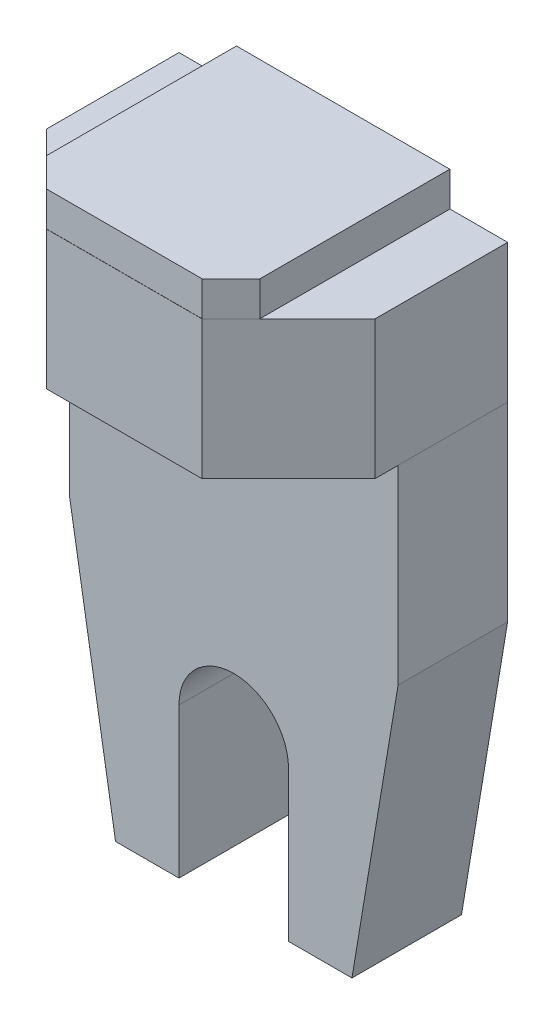
ISO-10303-21;
HEADER;
FILE_DESCRIPTION(('STEP AP214'),'2;1');
FILE_NAME('part.step','',(''),(''),'','','');
FILE_SCHEMA(('AUTOMOTIVE_DESIGN { 1 0 10303 214 1 1 1 1 }'));
ENDSEC;
DATA;
#1=APPLICATION_CONTEXT('core data for automotive mechanical design processes');
#2=APPLICATION_PROTOCOL_DEFINITION('international standard','automotive_design',2000,#1);
#3=PRODUCT_CONTEXT('',#1,'mechanical');
#4=PRODUCT('Part','Part','',(#3));
#5=PRODUCT_RELATED_PRODUCT_CATEGORY('part','',(#4));
#6=PRODUCT_DEFINITION_FORMATION('','',#4);
#7=PRODUCT_DEFINITION_CONTEXT('part definition',#1,'design');
#8=PRODUCT_DEFINITION('design','',#6,#7);
#9=PRODUCT_DEFINITION_SHAPE('','',#8);
#10=(LENGTH_UNIT() NAMED_UNIT(*) SI_UNIT(.MILLI.,.METRE.));
#11=(NAMED_UNIT(*) PLANE_ANGLE_UNIT() SI_UNIT($,.RADIAN.));
#12=(NAMED_UNIT(*) SI_UNIT($,.STERADIAN.) SOLID_ANGLE_UNIT());
#13=UNCERTAINTY_MEASURE_WITH_UNIT(LENGTH_MEASURE(1.E-05),#10,'distance_accuracy_value','');
#14=(GEOMETRIC_REPRESENTATION_CONTEXT(3) GLOBAL_UNCERTAINTY_ASSIGNED_CONTEXT((#13)) GLOBAL_UNIT_ASSIGNED_CONTEXT((#10,
#11,#12)) REPRESENTATION_CONTEXT('',''));
#15=CARTESIAN_POINT('',(0.,0.,0.));
#16=DIRECTION('',(0.,0.,1.));
#17=DIRECTION('',(1.,0.,0.));
#18=AXIS2_PLACEMENT_3D('',#15,#16,#17);
#19=CARTESIAN_POINT('',(-28.5,52.5,19.));
#20=DIRECTION('',(0.,-1.,0.));
#21=DIRECTION('',(0.,0.,-1.));
#22=AXIS2_PLACEMENT_3D('',#19,#20,#21);
#23=PLANE('',#22);
#24=DIRECTION('',(0.,0.,-1.));
#25=VECTOR('',#24,1.);
#26=CARTESIAN_POINT('',(28.5016703983001,52.5,0.));
#27=LINE('',#26,#25);
#28=CARTESIAN_POINT('',(28.5016703983001,52.5,23.));
#29=VERTEX_POINT('',#28);
#30=CARTESIAN_POINT('',(28.5016703983001,52.5,0.));
#31=VERTEX_POINT('',#30);
#32=EDGE_CURVE('E221',#29,#31,#27,.T.);
#33=ORIENTED_EDGE('',*,*,#32,.T.);
#34=DIRECTION('',(-1.,0.,0.));
#35=VECTOR('',#34,1.);
#36=CARTESIAN_POINT('',(-28.5,52.5,0.));
#37=LINE('',#36,#35);
#38=CARTESIAN_POINT('',(-28.5,52.5,0.));
#39=VERTEX_POINT('',#38);
#40=EDGE_CURVE('E357',#31,#39,#37,.T.);
#41=ORIENTED_EDGE('',*,*,#40,.T.);
#42=DIRECTION('',(0.,0.,-1.));
#43=VECTOR('',#42,1.);
#44=CARTESIAN_POINT('',(-28.5,52.5,19.));
#45=LINE('',#44,#43);
#46=CARTESIAN_POINT('',(-28.5,52.5,23.));
#47=VERTEX_POINT('',#46);
#48=EDGE_CURVE('E11',#47,#39,#45,.T.);
#49=ORIENTED_EDGE('',*,*,#48,.F.);
#50=DIRECTION('',(0.707106781186548,0.,0.707106781186547));
#51=VECTOR('',#50,1.);
#52=CARTESIAN_POINT('',(-28.5,52.5,23.));
#53=LINE('',#52,#51);
#54=CARTESIAN_POINT('',(-13.5,52.5,38.));
#55=VERTEX_POINT('',#54);
#56=EDGE_CURVE('E206',#47,#55,#53,.T.);
#57=ORIENTED_EDGE('',*,*,#56,.T.);
#58=DIRECTION('',(1.,0.,0.));
#59=VECTOR('',#58,1.);
#60=CARTESIAN_POINT('',(-13.5,52.5,38.));
#61=LINE('',#60,#59);
#62=CARTESIAN_POINT('',(13.5016703983001,52.5,38.));
#63=VERTEX_POINT('',#62);
#64=EDGE_CURVE('E211',#55,#63,#61,.T.);
#65=ORIENTED_EDGE('',*,*,#64,.T.);
#66=DIRECTION('',(0.707106781186547,0.,-0.707106781186548));
#67=VECTOR('',#66,1.);
#68=CARTESIAN_POINT('',(13.5016703983001,52.5,38.));
#69=LINE('',#68,#67);
#70=EDGE_CURVE('E245',#63,#29,#69,.T.);
#71=ORIENTED_EDGE('',*,*,#70,.T.);
#72=EDGE_LOOP('',(#33,#41,#49,#57,#65,#71));
#73=FACE_BOUND('',#72,.T.);
#74=DIRECTION('',(0.,0.,-1.));
#75=VECTOR('',#74,1.);
#76=CARTESIAN_POINT('',(18.5,52.5,0.0299013030524108));
#77=LINE('',#76,#75);
#78=CARTESIAN_POINT('',(18.5,52.5,32.9731751320924));
#79=VERTEX_POINT('',#78);
#80=CARTESIAN_POINT('',(18.5,52.5,0.0299013030524108));
#81=VERTEX_POINT('',#80);
#82=EDGE_CURVE('E55',#79,#81,#77,.T.);
#83=ORIENTED_EDGE('',*,*,#82,.F.);
#84=DIRECTION('',(0.707106781186547,0.,-0.707106781186549));
#85=VECTOR('',#84,1.);
#86=CARTESIAN_POINT('',(18.5,52.5,32.9731751320924));
#87=LINE('',#86,#85);
#88=CARTESIAN_POINT('',(13.5,52.5,37.9731751320924));
#89=VERTEX_POINT('',#88);
#90=EDGE_CURVE('E59',#89,#79,#87,.T.);
#91=ORIENTED_EDGE('',*,*,#90,.F.);
#92=DIRECTION('',(1.,0.,0.));
#93=VECTOR('',#92,1.);
#94=CARTESIAN_POINT('',(13.5,52.5,37.9731751320924));
#95=LINE('',#94,#93);
#96=CARTESIAN_POINT('',(-13.5,52.5,37.9731751320924));
#97=VERTEX_POINT('',#96);
#98=EDGE_CURVE('E634',#97,#89,#95,.T.);
#99=ORIENTED_EDGE('',*,*,#98,.F.);
#100=DIRECTION('',(0.707106781186547,0.,0.707106781186548));
#101=VECTOR('',#100,1.);
#102=CARTESIAN_POINT('',(-13.5,52.5,37.9731751320924));
#103=LINE('',#102,#101);
#104=CARTESIAN_POINT('',(-18.5,52.5,32.9731751320924));
#105=VERTEX_POINT('',#104);
#106=EDGE_CURVE('E654',#105,#97,#103,.T.);
#107=ORIENTED_EDGE('',*,*,#106,.F.);
#108=DIRECTION('',(0.,0.,1.));
#109=VECTOR('',#108,1.);
#110=CARTESIAN_POINT('',(-18.5,52.5,0.0299013030524153));
#111=LINE('',#110,#109);
#112=CARTESIAN_POINT('',(-18.5,52.5,0.0299013030524153));
#113=VERTEX_POINT('',#112);
#114=EDGE_CURVE('E657',#113,#105,#111,.T.);
#115=ORIENTED_EDGE('',*,*,#114,.F.);
#116=DIRECTION('',(-1.,0.,0.));
#117=VECTOR('',#116,1.);
#118=CARTESIAN_POINT('',(18.5,52.5,0.0299013030524108));
#119=LINE('',#118,#117);
#120=EDGE_CURVE('E659',#81,#113,#119,.T.);
#121=ORIENTED_EDGE('',*,*,#120,.F.);
#122=EDGE_LOOP('',(#83,#91,#99,#107,#115,#121));
#123=FACE_BOUND('',#122,.T.);
#124=ADVANCED_FACE('F39',(#73,#123),#23,.F.);
#125=CARTESIAN_POINT('',(28.5,-52.5,19.));
#126=DIRECTION('',(-1.,0.,0.));
#127=DIRECTION('',(0.,0.,1.));
#128=AXIS2_PLACEMENT_3D('',#125,#126,#127);
#129=PLANE('',#128);
#130=DIRECTION('',(0.,0.,-1.));
#131=VECTOR('',#130,1.);
#132=CARTESIAN_POINT('',(28.5,28.5,19.));
#133=LINE('',#132,#131);
#134=CARTESIAN_POINT('',(28.5,28.5,19.));
#135=VERTEX_POINT('',#134);
#136=CARTESIAN_POINT('',(28.5,28.5,0.));
#137=VERTEX_POINT('',#136);
#138=EDGE_CURVE('E272',#135,#137,#133,.T.);
#139=ORIENTED_EDGE('',*,*,#138,.F.);
#140=DIRECTION('',(0.,1.,0.));
#141=VECTOR('',#140,1.);
#142=CARTESIAN_POINT('',(28.5,-52.5,19.));
#143=LINE('',#142,#141);
#144=CARTESIAN_POINT('',(28.5,-4.5,19.));
#145=VERTEX_POINT('',#144);
#146=EDGE_CURVE('E343',#145,#135,#143,.T.);
#147=ORIENTED_EDGE('',*,*,#146,.F.);
#148=DIRECTION('',(0.,0.,1.));
#149=VECTOR('',#148,1.);
#150=CARTESIAN_POINT('',(28.5,-4.5,0.));
#151=LINE('',#150,#149);
#152=CARTESIAN_POINT('',(28.5,-4.5,0.));
#153=VERTEX_POINT('',#152);
#154=EDGE_CURVE('E332',#153,#145,#151,.T.);
#155=ORIENTED_EDGE('',*,*,#154,.F.);
#156=DIRECTION('',(0.,1.,0.));
#157=VECTOR('',#156,1.);
#158=CARTESIAN_POINT('',(28.5,-52.5,0.));
#159=LINE('',#158,#157);
#160=EDGE_CURVE('E340',#153,#137,#159,.T.);
#161=ORIENTED_EDGE('',*,*,#160,.T.);
#162=EDGE_LOOP('',(#139,#147,#155,#161));
#163=FACE_BOUND('',#162,.T.);
#164=ADVANCED_FACE('F41',(#163),#129,.F.);
#165=CARTESIAN_POINT('',(0.,0.,19.));
#166=DIRECTION('',(0.,0.,-1.));
#167=DIRECTION('',(-1.,0.,0.));
#168=AXIS2_PLACEMENT_3D('',#165,#166,#167);
#169=PLANE('',#168);
#170=DIRECTION('',(1.,0.,0.));
#171=VECTOR('',#170,1.);
#172=CARTESIAN_POINT('',(0.,28.5,19.));
#173=LINE('',#172,#171);
#174=CARTESIAN_POINT('',(-28.5,28.5,19.));
#175=VERTEX_POINT('',#174);
#176=EDGE_CURVE('E256',#175,#135,#173,.T.);
#177=ORIENTED_EDGE('',*,*,#176,.F.);
#178=DIRECTION('',(0.,-1.,0.));
#179=VECTOR('',#178,1.);
#180=CARTESIAN_POINT('',(-28.5,-52.5,19.));
#181=LINE('',#180,#179);
#182=CARTESIAN_POINT('',(-28.5,-4.5,19.));
#183=VERTEX_POINT('',#182);
#184=EDGE_CURVE('E347',#175,#183,#181,.T.);
#185=ORIENTED_EDGE('',*,*,#184,.T.);
#186=DIRECTION('',(-0.164398987305357,0.986393923832144,0.));
#187=VECTOR('',#186,1.);
#188=CARTESIAN_POINT('',(-28.5,-4.5,19.));
#189=LINE('',#188,#187);
#190=CARTESIAN_POINT('',(-20.5,-52.5,19.));
#191=VERTEX_POINT('',#190);
#192=EDGE_CURVE('E304',#191,#183,#189,.T.);
#193=ORIENTED_EDGE('',*,*,#192,.F.);
#194=DIRECTION('',(1.,0.,0.));
#195=VECTOR('',#194,1.);
#196=CARTESIAN_POINT('',(-28.5,-52.5,19.));
#197=LINE('',#196,#195);
#198=CARTESIAN_POINT('',(-9.49999999999999,-52.5,19.));
#199=VERTEX_POINT('',#198);
#200=EDGE_CURVE('E48',#191,#199,#197,.T.);
#201=ORIENTED_EDGE('',*,*,#200,.T.);
#202=DIRECTION('',(0.,-1.,0.));
#203=VECTOR('',#202,1.);
#204=CARTESIAN_POINT('',(-9.49999999999999,-52.5,19.));
#205=LINE('',#204,#203);
#206=CARTESIAN_POINT('',(-9.49999999999999,-26.5,19.));
#207=VERTEX_POINT('',#206);
#208=EDGE_CURVE('E282',#207,#199,#205,.T.);
#209=ORIENTED_EDGE('',*,*,#208,.F.);
#210=CARTESIAN_POINT('',(0.,-26.5,19.));
#211=DIRECTION('',(0.,0.,1.));
#212=DIRECTION('',(-1.,0.,0.));
#213=AXIS2_PLACEMENT_3D('',#210,#211,#212);
#214=CIRCLE('',#213,9.5);
#215=CARTESIAN_POINT('',(9.50000000000001,-26.5,19.));
#216=VERTEX_POINT('',#215);
#217=EDGE_CURVE('E294',#216,#207,#214,.T.);
#218=ORIENTED_EDGE('',*,*,#217,.F.);
#219=DIRECTION('',(0.,1.,0.));
#220=VECTOR('',#219,1.);
#221=CARTESIAN_POINT('',(9.50000000000001,-52.5,19.));
#222=LINE('',#221,#220);
#223=CARTESIAN_POINT('',(9.50000000000001,-52.5,19.));
#224=VERTEX_POINT('',#223);
#225=EDGE_CURVE('E276',#224,#216,#222,.T.);
#226=ORIENTED_EDGE('',*,*,#225,.F.);
#227=CARTESIAN_POINT('',(20.5,-52.5,19.));
#228=VERTEX_POINT('',#227);
#229=EDGE_CURVE('E351',#224,#228,#197,.T.);
#230=ORIENTED_EDGE('',*,*,#229,.T.);
#231=DIRECTION('',(-0.164398987305357,-0.986393923832144,0.));
#232=VECTOR('',#231,1.);
#233=CARTESIAN_POINT('',(20.5,-52.5,19.));
#234=LINE('',#233,#232);
#235=EDGE_CURVE('E325',#145,#228,#234,.T.);
#236=ORIENTED_EDGE('',*,*,#235,.F.);
#237=ORIENTED_EDGE('',*,*,#146,.T.);
#238=EDGE_LOOP('',(#177,#185,#193,#201,#209,#218,#226,#230,#236,#237));
#239=FACE_BOUND('',#238,.T.);
#240=ADVANCED_FACE('F392',(#239),#169,.F.);
#241=CARTESIAN_POINT('',(-28.5,-52.5,19.));
#242=DIRECTION('',(0.,1.,0.));
#243=DIRECTION('',(0.,0.,1.));
#244=AXIS2_PLACEMENT_3D('',#241,#242,#243);
#245=PLANE('',#244);
#246=DIRECTION('',(1.,0.,0.));
#247=VECTOR('',#246,1.);
#248=CARTESIAN_POINT('',(-28.5,-52.5,0.));
#249=LINE('',#248,#247);
#250=CARTESIAN_POINT('',(-20.5,-52.5,0.));
#251=VERTEX_POINT('',#250);
#252=CARTESIAN_POINT('',(-9.49999999999999,-52.5,0.));
#253=VERTEX_POINT('',#252);
#254=EDGE_CURVE('E348',#251,#253,#249,.T.);
#255=ORIENTED_EDGE('',*,*,#254,.T.);
#256=DIRECTION('',(0.,0.,1.));
#257=VECTOR('',#256,1.);
#258=CARTESIAN_POINT('',(-9.49999999999999,-52.5,0.));
#259=LINE('',#258,#257);
#260=EDGE_CURVE('E300',#253,#199,#259,.T.);
#261=ORIENTED_EDGE('',*,*,#260,.T.);
#262=ORIENTED_EDGE('',*,*,#200,.F.);
#263=DIRECTION('',(0.,0.,1.));
#264=VECTOR('',#263,1.);
#265=CARTESIAN_POINT('',(-20.5,-52.5,0.));
#266=LINE('',#265,#264);
#267=EDGE_CURVE('E317',#251,#191,#266,.T.);
#268=ORIENTED_EDGE('',*,*,#267,.F.);
#269=EDGE_LOOP('',(#255,#261,#262,#268));
#270=FACE_BOUND('',#269,.T.);
#271=ADVANCED_FACE('F406',(#270),#245,.F.);
#272=CARTESIAN_POINT('',(-28.5,-52.5,19.));
#273=DIRECTION('',(1.,0.,0.));
#274=DIRECTION('',(0.,0.,-1.));
#275=AXIS2_PLACEMENT_3D('',#272,#273,#274);
#276=PLANE('',#275);
#277=DIRECTION('',(0.,-1.,0.));
#278=VECTOR('',#277,1.);
#279=CARTESIAN_POINT('',(-28.5,-52.5,0.));
#280=LINE('',#279,#278);
#281=CARTESIAN_POINT('',(-28.5,-4.49999999999991,0.));
#282=VERTEX_POINT('',#281);
#283=EDGE_CURVE('E360',#39,#282,#280,.T.);
#284=ORIENTED_EDGE('',*,*,#283,.T.);
#285=DIRECTION('',(0.,0.,1.));
#286=VECTOR('',#285,1.);
#287=CARTESIAN_POINT('',(-28.5,-4.5,0.));
#288=LINE('',#287,#286);
#289=EDGE_CURVE('E321',#282,#183,#288,.T.);
#290=ORIENTED_EDGE('',*,*,#289,.T.);
#291=ORIENTED_EDGE('',*,*,#184,.F.);
#292=DIRECTION('',(0.,0.,1.));
#293=VECTOR('',#292,1.);
#294=CARTESIAN_POINT('',(-28.5,28.5,0.));
#295=LINE('',#294,#293);
#296=CARTESIAN_POINT('',(-28.5,28.5,23.));
#297=VERTEX_POINT('',#296);
#298=EDGE_CURVE('E217',#175,#297,#295,.T.);
#299=ORIENTED_EDGE('',*,*,#298,.T.);
#300=DIRECTION('',(0.,1.,0.));
#301=VECTOR('',#300,1.);
#302=CARTESIAN_POINT('',(-28.5,28.5,23.));
#303=LINE('',#302,#301);
#304=EDGE_CURVE('E240',#297,#47,#303,.T.);
#305=ORIENTED_EDGE('',*,*,#304,.T.);
#306=ORIENTED_EDGE('',*,*,#48,.T.);
#307=EDGE_LOOP('',(#284,#290,#291,#299,#305,#306));
#308=FACE_BOUND('',#307,.T.);
#309=ADVANCED_FACE('F395',(#308),#276,.F.);
#310=ORIENTED_EDGE('',*,*,#229,.F.);
#311=DIRECTION('',(0.,0.,1.));
#312=VECTOR('',#311,1.);
#313=CARTESIAN_POINT('',(9.50000000000001,-52.5,0.));
#314=LINE('',#313,#312);
#315=CARTESIAN_POINT('',(9.50000000000001,-52.5,0.));
#316=VERTEX_POINT('',#315);
#317=EDGE_CURVE('E290',#316,#224,#314,.T.);
#318=ORIENTED_EDGE('',*,*,#317,.F.);
#319=CARTESIAN_POINT('',(20.5,-52.5,0.));
#320=VERTEX_POINT('',#319);
#321=EDGE_CURVE('E362',#316,#320,#249,.T.);
#322=ORIENTED_EDGE('',*,*,#321,.T.);
#323=DIRECTION('',(0.,0.,1.));
#324=VECTOR('',#323,1.);
#325=CARTESIAN_POINT('',(20.5,-52.5,0.));
#326=LINE('',#325,#324);
#327=EDGE_CURVE('E336',#320,#228,#326,.T.);
#328=ORIENTED_EDGE('',*,*,#327,.T.);
#329=EDGE_LOOP('',(#310,#318,#322,#328));
#330=FACE_BOUND('',#329,.T.);
#331=ADVANCED_FACE('F374',(#330),#245,.F.);
#332=CARTESIAN_POINT('',(0.,0.,0.));
#333=DIRECTION('',(0.,0.,-1.));
#334=DIRECTION('',(-1.,0.,0.));
#335=AXIS2_PLACEMENT_3D('',#332,#333,#334);
#336=PLANE('',#335);
#337=ORIENTED_EDGE('',*,*,#40,.F.);
#338=DIRECTION('',(0.,1.,0.));
#339=VECTOR('',#338,1.);
#340=CARTESIAN_POINT('',(28.5016703983001,28.5,0.));
#341=LINE('',#340,#339);
#342=CARTESIAN_POINT('',(28.5016703983001,28.5,0.));
#343=VERTEX_POINT('',#342);
#344=EDGE_CURVE('E252',#343,#31,#341,.T.);
#345=ORIENTED_EDGE('',*,*,#344,.F.);
#346=DIRECTION('',(-1.,0.,0.));
#347=VECTOR('',#346,1.);
#348=CARTESIAN_POINT('',(-28.5,28.5,0.));
#349=LINE('',#348,#347);
#350=EDGE_CURVE('E237',#343,#137,#349,.T.);
#351=ORIENTED_EDGE('',*,*,#350,.T.);
#352=ORIENTED_EDGE('',*,*,#160,.F.);
#353=DIRECTION('',(-0.164398987305357,-0.986393923832144,0.));
#354=VECTOR('',#353,1.);
#355=CARTESIAN_POINT('',(20.5,-52.5,0.));
#356=LINE('',#355,#354);
#357=EDGE_CURVE('E328',#153,#320,#356,.T.);
#358=ORIENTED_EDGE('',*,*,#357,.T.);
#359=ORIENTED_EDGE('',*,*,#321,.F.);
#360=DIRECTION('',(0.,1.,0.));
#361=VECTOR('',#360,1.);
#362=CARTESIAN_POINT('',(9.50000000000001,-52.5,0.));
#363=LINE('',#362,#361);
#364=CARTESIAN_POINT('',(9.50000000000001,-26.5,0.));
#365=VERTEX_POINT('',#364);
#366=EDGE_CURVE('E277',#316,#365,#363,.T.);
#367=ORIENTED_EDGE('',*,*,#366,.T.);
#368=CARTESIAN_POINT('',(0.,-26.5,0.));
#369=DIRECTION('',(0.,0.,1.));
#370=DIRECTION('',(-1.,0.,0.));
#371=AXIS2_PLACEMENT_3D('',#368,#369,#370);
#372=CIRCLE('',#371,9.5);
#373=CARTESIAN_POINT('',(-9.49999999999999,-26.5,0.));
#374=VERTEX_POINT('',#373);
#375=EDGE_CURVE('E281',#365,#374,#372,.T.);
#376=ORIENTED_EDGE('',*,*,#375,.T.);
#377=DIRECTION('',(0.,-1.,0.));
#378=VECTOR('',#377,1.);
#379=CARTESIAN_POINT('',(-9.49999999999999,-52.5,0.));
#380=LINE('',#379,#378);
#381=EDGE_CURVE('E286',#374,#253,#380,.T.);
#382=ORIENTED_EDGE('',*,*,#381,.T.);
#383=ORIENTED_EDGE('',*,*,#254,.F.);
#384=DIRECTION('',(-0.164398987305357,0.986393923832144,0.));
#385=VECTOR('',#384,1.);
#386=CARTESIAN_POINT('',(-28.5,-4.5,0.));
#387=LINE('',#386,#385);
#388=EDGE_CURVE('E313',#251,#282,#387,.T.);
#389=ORIENTED_EDGE('',*,*,#388,.T.);
#390=ORIENTED_EDGE('',*,*,#283,.F.);
#391=EDGE_LOOP('',(#337,#345,#351,#352,#358,#359,#367,#376,#382,#383,#389,#390));
#392=FACE_BOUND('',#391,.T.);
#393=ADVANCED_FACE('F381',(#392),#336,.T.);
#394=CARTESIAN_POINT('',(20.5,-52.5,0.));
#395=DIRECTION('',(-0.986393923832144,0.164398987305357,0.));
#396=DIRECTION('',(-0.164398987305357,-0.986393923832144,0.));
#397=AXIS2_PLACEMENT_3D('',#394,#395,#396);
#398=PLANE('',#397);
#399=ORIENTED_EDGE('',*,*,#235,.T.);
#400=ORIENTED_EDGE('',*,*,#327,.F.);
#401=ORIENTED_EDGE('',*,*,#357,.F.);
#402=ORIENTED_EDGE('',*,*,#154,.T.);
#403=EDGE_LOOP('',(#399,#400,#401,#402));
#404=FACE_BOUND('',#403,.T.);
#405=ADVANCED_FACE('F377',(#404),#398,.F.);
#406=CARTESIAN_POINT('',(-28.5,-4.5,0.));
#407=DIRECTION('',(0.986393923832144,0.164398987305357,0.));
#408=DIRECTION('',(-0.164398987305357,0.986393923832144,0.));
#409=AXIS2_PLACEMENT_3D('',#406,#407,#408);
#410=PLANE('',#409);
#411=ORIENTED_EDGE('',*,*,#192,.T.);
#412=ORIENTED_EDGE('',*,*,#289,.F.);
#413=ORIENTED_EDGE('',*,*,#388,.F.);
#414=ORIENTED_EDGE('',*,*,#267,.T.);
#415=EDGE_LOOP('',(#411,#412,#413,#414));
#416=FACE_BOUND('',#415,.T.);
#417=ADVANCED_FACE('F400',(#416),#410,.F.);
#418=CARTESIAN_POINT('',(-9.49999999999999,-52.5,0.));
#419=DIRECTION('',(-1.,0.,0.));
#420=DIRECTION('',(0.,0.,1.));
#421=AXIS2_PLACEMENT_3D('',#418,#419,#420);
#422=PLANE('',#421);
#423=ORIENTED_EDGE('',*,*,#208,.T.);
#424=ORIENTED_EDGE('',*,*,#260,.F.);
#425=ORIENTED_EDGE('',*,*,#381,.F.);
#426=DIRECTION('',(0.,0.,1.));
#427=VECTOR('',#426,1.);
#428=CARTESIAN_POINT('',(-9.49999999999999,-26.5,0.));
#429=LINE('',#428,#427);
#430=EDGE_CURVE('E305',#374,#207,#429,.T.);
#431=ORIENTED_EDGE('',*,*,#430,.T.);
#432=EDGE_LOOP('',(#423,#424,#425,#431));
#433=FACE_BOUND('',#432,.T.);
#434=ADVANCED_FACE('F403',(#433),#422,.F.);
#435=CARTESIAN_POINT('',(0.,-26.5,0.));
#436=DIRECTION('',(0.,0.,1.));
#437=DIRECTION('',(1.,0.,0.));
#438=AXIS2_PLACEMENT_3D('',#435,#436,#437);
#439=CYLINDRICAL_SURFACE('',#438,9.5);
#440=ORIENTED_EDGE('',*,*,#217,.T.);
#441=ORIENTED_EDGE('',*,*,#430,.F.);
#442=ORIENTED_EDGE('',*,*,#375,.F.);
#443=DIRECTION('',(0.,0.,1.));
#444=VECTOR('',#443,1.);
#445=CARTESIAN_POINT('',(9.50000000000001,-26.5,0.));
#446=LINE('',#445,#444);
#447=EDGE_CURVE('E308',#365,#216,#446,.T.);
#448=ORIENTED_EDGE('',*,*,#447,.T.);
#449=EDGE_LOOP('',(#440,#441,#442,#448));
#450=FACE_BOUND('',#449,.T.);
#451=ADVANCED_FACE('F410',(#450),#439,.F.);
#452=CARTESIAN_POINT('',(9.50000000000001,-52.5,0.));
#453=DIRECTION('',(1.,0.,0.));
#454=DIRECTION('',(0.,0.,-1.));
#455=AXIS2_PLACEMENT_3D('',#452,#453,#454);
#456=PLANE('',#455);
#457=ORIENTED_EDGE('',*,*,#225,.T.);
#458=ORIENTED_EDGE('',*,*,#447,.F.);
#459=ORIENTED_EDGE('',*,*,#366,.F.);
#460=ORIENTED_EDGE('',*,*,#317,.T.);
#461=EDGE_LOOP('',(#457,#458,#459,#460));
#462=FACE_BOUND('',#461,.T.);
#463=ADVANCED_FACE('F413',(#462),#456,.F.);
#464=CARTESIAN_POINT('',(0.,28.5,0.));
#465=DIRECTION('',(0.,1.,0.));
#466=DIRECTION('',(0.,0.,1.));
#467=AXIS2_PLACEMENT_3D('',#464,#465,#466);
#468=PLANE('',#467);
#469=ORIENTED_EDGE('',*,*,#176,.T.);
#470=ORIENTED_EDGE('',*,*,#138,.T.);
#471=ORIENTED_EDGE('',*,*,#350,.F.);
#472=DIRECTION('',(0.,0.,-1.));
#473=VECTOR('',#472,1.);
#474=CARTESIAN_POINT('',(28.5016703983001,28.5,0.));
#475=LINE('',#474,#473);
#476=CARTESIAN_POINT('',(28.5016703983001,28.5,23.));
#477=VERTEX_POINT('',#476);
#478=EDGE_CURVE('E233',#477,#343,#475,.T.);
#479=ORIENTED_EDGE('',*,*,#478,.F.);
#480=DIRECTION('',(0.707106781186547,0.,-0.707106781186548));
#481=VECTOR('',#480,1.);
#482=CARTESIAN_POINT('',(13.5016703983001,28.5,38.));
#483=LINE('',#482,#481);
#484=CARTESIAN_POINT('',(13.5016703983001,28.5,38.));
#485=VERTEX_POINT('',#484);
#486=EDGE_CURVE('E229',#485,#477,#483,.T.);
#487=ORIENTED_EDGE('',*,*,#486,.F.);
#488=DIRECTION('',(1.,0.,0.));
#489=VECTOR('',#488,1.);
#490=CARTESIAN_POINT('',(-13.5,28.5,38.));
#491=LINE('',#490,#489);
#492=CARTESIAN_POINT('',(-13.5,28.5,38.));
#493=VERTEX_POINT('',#492);
#494=EDGE_CURVE('E225',#493,#485,#491,.T.);
#495=ORIENTED_EDGE('',*,*,#494,.F.);
#496=DIRECTION('',(0.707106781186548,0.,0.707106781186547));
#497=VECTOR('',#496,1.);
#498=CARTESIAN_POINT('',(-28.5,28.5,23.));
#499=LINE('',#498,#497);
#500=EDGE_CURVE('E220',#297,#493,#499,.T.);
#501=ORIENTED_EDGE('',*,*,#500,.F.);
#502=ORIENTED_EDGE('',*,*,#298,.F.);
#503=EDGE_LOOP('',(#469,#470,#471,#479,#487,#495,#501,#502));
#504=FACE_BOUND('',#503,.T.);
#505=ADVANCED_FACE('F386',(#504),#468,.F.);
#506=CARTESIAN_POINT('',(28.5016703983001,28.5,0.));
#507=DIRECTION('',(1.,0.,0.));
#508=DIRECTION('',(0.,0.,-1.));
#509=AXIS2_PLACEMENT_3D('',#506,#507,#508);
#510=PLANE('',#509);
#511=ORIENTED_EDGE('',*,*,#32,.F.);
#512=DIRECTION('',(0.,1.,0.));
#513=VECTOR('',#512,1.);
#514=CARTESIAN_POINT('',(28.5016703983001,28.5,23.));
#515=LINE('',#514,#513);
#516=EDGE_CURVE('E257',#477,#29,#515,.T.);
#517=ORIENTED_EDGE('',*,*,#516,.F.);
#518=ORIENTED_EDGE('',*,*,#478,.T.);
#519=ORIENTED_EDGE('',*,*,#344,.T.);
#520=EDGE_LOOP('',(#511,#517,#518,#519));
#521=FACE_BOUND('',#520,.T.);
#522=ADVANCED_FACE('F420',(#521),#510,.T.);
#523=CARTESIAN_POINT('',(13.5016703983001,28.5,38.));
#524=DIRECTION('',(0.707106781186548,0.,0.707106781186547));
#525=DIRECTION('',(0.707106781186547,0.,-0.707106781186548));
#526=AXIS2_PLACEMENT_3D('',#523,#524,#525);
#527=PLANE('',#526);
#528=ORIENTED_EDGE('',*,*,#70,.F.);
#529=DIRECTION('',(0.,1.,0.));
#530=VECTOR('',#529,1.);
#531=CARTESIAN_POINT('',(13.5016703983001,28.5,38.));
#532=LINE('',#531,#530);
#533=EDGE_CURVE('E260',#485,#63,#532,.T.);
#534=ORIENTED_EDGE('',*,*,#533,.F.);
#535=ORIENTED_EDGE('',*,*,#486,.T.);
#536=ORIENTED_EDGE('',*,*,#516,.T.);
#537=EDGE_LOOP('',(#528,#534,#535,#536));
#538=FACE_BOUND('',#537,.T.);
#539=ADVANCED_FACE('F454',(#538),#527,.T.);
#540=CARTESIAN_POINT('',(-13.5,28.5,38.));
#541=DIRECTION('',(0.,0.,1.));
#542=DIRECTION('',(1.,0.,0.));
#543=AXIS2_PLACEMENT_3D('',#540,#541,#542);
#544=PLANE('',#543);
#545=ORIENTED_EDGE('',*,*,#64,.F.);
#546=DIRECTION('',(0.,1.,0.));
#547=VECTOR('',#546,1.);
#548=CARTESIAN_POINT('',(-13.5,28.5,38.));
#549=LINE('',#548,#547);
#550=EDGE_CURVE('E263',#493,#55,#549,.T.);
#551=ORIENTED_EDGE('',*,*,#550,.F.);
#552=ORIENTED_EDGE('',*,*,#494,.T.);
#553=ORIENTED_EDGE('',*,*,#533,.T.);
#554=EDGE_LOOP('',(#545,#551,#552,#553));
#555=FACE_BOUND('',#554,.T.);
#556=ADVANCED_FACE('F450',(#555),#544,.T.);
#557=CARTESIAN_POINT('',(-28.5,28.5,23.));
#558=DIRECTION('',(-0.707106781186547,0.,0.707106781186548));
#559=DIRECTION('',(0.707106781186548,0.,0.707106781186547));
#560=AXIS2_PLACEMENT_3D('',#557,#558,#559);
#561=PLANE('',#560);
#562=ORIENTED_EDGE('',*,*,#56,.F.);
#563=ORIENTED_EDGE('',*,*,#304,.F.);
#564=ORIENTED_EDGE('',*,*,#500,.T.);
#565=ORIENTED_EDGE('',*,*,#550,.T.);
#566=EDGE_LOOP('',(#562,#563,#564,#565));
#567=FACE_BOUND('',#566,.T.);
#568=ADVANCED_FACE('F447',(#567),#561,.T.);
#569=CARTESIAN_POINT('',(18.5,58.5,0.0299013030524108));
#570=DIRECTION('',(-1.,0.,0.));
#571=DIRECTION('',(0.,0.,1.));
#572=AXIS2_PLACEMENT_3D('',#569,#570,#571);
#573=PLANE('',#572);
#574=ORIENTED_EDGE('',*,*,#82,.T.);
#575=DIRECTION('',(0.,-1.,0.));
#576=VECTOR('',#575,1.);
#577=CARTESIAN_POINT('',(18.5,58.5,0.0299013030524108));
#578=LINE('',#577,#576);
#579=CARTESIAN_POINT('',(18.5,58.5,0.0299013030524108));
#580=VERTEX_POINT('',#579);
#581=EDGE_CURVE('E186',#580,#81,#578,.T.);
#582=ORIENTED_EDGE('',*,*,#581,.F.);
#583=DIRECTION('',(0.,0.,-1.));
#584=VECTOR('',#583,1.);
#585=CARTESIAN_POINT('',(18.5,58.5,0.0299013030524108));
#586=LINE('',#585,#584);
#587=CARTESIAN_POINT('',(18.5,58.5,32.9731751320924));
#588=VERTEX_POINT('',#587);
#589=EDGE_CURVE('E193',#588,#580,#586,.T.);
#590=ORIENTED_EDGE('',*,*,#589,.F.);
#591=DIRECTION('',(0.,-1.,0.));
#592=VECTOR('',#591,1.);
#593=CARTESIAN_POINT('',(18.5,58.5,32.9731751320924));
#594=LINE('',#593,#592);
#595=EDGE_CURVE('E630',#588,#79,#594,.T.);
#596=ORIENTED_EDGE('',*,*,#595,.T.);
#597=EDGE_LOOP('',(#574,#582,#590,#596));
#598=FACE_BOUND('',#597,.T.);
#599=ADVANCED_FACE('F204',(#598),#573,.F.);
#600=CARTESIAN_POINT('',(18.5,58.5,0.0299013030524108));
#601=DIRECTION('',(0.,0.,1.));
#602=DIRECTION('',(1.,0.,0.));
#603=AXIS2_PLACEMENT_3D('',#600,#601,#602);
#604=PLANE('',#603);
#605=ORIENTED_EDGE('',*,*,#120,.T.);
#606=DIRECTION('',(0.,-1.,0.));
#607=VECTOR('',#606,1.);
#608=CARTESIAN_POINT('',(-18.5,58.5,0.0299013030524153));
#609=LINE('',#608,#607);
#610=CARTESIAN_POINT('',(-18.5,58.5,0.0299013030524153));
#611=VERTEX_POINT('',#610);
#612=EDGE_CURVE('E188',#611,#113,#609,.T.);
#613=ORIENTED_EDGE('',*,*,#612,.F.);
#614=DIRECTION('',(-1.,0.,0.));
#615=VECTOR('',#614,1.);
#616=CARTESIAN_POINT('',(18.5,58.5,0.0299013030524108));
#617=LINE('',#616,#615);
#618=EDGE_CURVE('E181',#580,#611,#617,.T.);
#619=ORIENTED_EDGE('',*,*,#618,.F.);
#620=ORIENTED_EDGE('',*,*,#581,.T.);
#621=EDGE_LOOP('',(#605,#613,#619,#620));
#622=FACE_BOUND('',#621,.T.);
#623=ADVANCED_FACE('F184',(#622),#604,.F.);
#624=CARTESIAN_POINT('',(-18.5,58.5,0.0299013030524153));
#625=DIRECTION('',(1.,0.,0.));
#626=DIRECTION('',(0.,0.,-1.));
#627=AXIS2_PLACEMENT_3D('',#624,#625,#626);
#628=PLANE('',#627);
#629=ORIENTED_EDGE('',*,*,#114,.T.);
#630=DIRECTION('',(0.,-1.,0.));
#631=VECTOR('',#630,1.);
#632=CARTESIAN_POINT('',(-18.5,58.5,32.9731751320924));
#633=LINE('',#632,#631);
#634=CARTESIAN_POINT('',(-18.5,58.5,32.9731751320924));
#635=VERTEX_POINT('',#634);
#636=EDGE_CURVE('E213',#635,#105,#633,.T.);
#637=ORIENTED_EDGE('',*,*,#636,.F.);
#638=DIRECTION('',(0.,0.,1.));
#639=VECTOR('',#638,1.);
#640=CARTESIAN_POINT('',(-18.5,58.5,0.0299013030524153));
#641=LINE('',#640,#639);
#642=EDGE_CURVE('E192',#611,#635,#641,.T.);
#643=ORIENTED_EDGE('',*,*,#642,.F.);
#644=ORIENTED_EDGE('',*,*,#612,.T.);
#645=EDGE_LOOP('',(#629,#637,#643,#644));
#646=FACE_BOUND('',#645,.T.);
#647=ADVANCED_FACE('F466',(#646),#628,.F.);
#648=CARTESIAN_POINT('',(-13.5,58.5,37.9731751320924));
#649=DIRECTION('',(0.707106781186548,0.,-0.707106781186547));
#650=DIRECTION('',(-0.707106781186547,0.,-0.707106781186548));
#651=AXIS2_PLACEMENT_3D('',#648,#649,#650);
#652=PLANE('',#651);
#653=ORIENTED_EDGE('',*,*,#106,.T.);
#654=DIRECTION('',(0.,-1.,0.));
#655=VECTOR('',#654,1.);
#656=CARTESIAN_POINT('',(-13.5,58.5,37.9731751320924));
#657=LINE('',#656,#655);
#658=CARTESIAN_POINT('',(-13.5,58.5,37.9731751320924));
#659=VERTEX_POINT('',#658);
#660=EDGE_CURVE('E640',#659,#97,#657,.T.);
#661=ORIENTED_EDGE('',*,*,#660,.F.);
#662=DIRECTION('',(0.707106781186547,0.,0.707106781186548));
#663=VECTOR('',#662,1.);
#664=CARTESIAN_POINT('',(-13.5,58.5,37.9731751320924));
#665=LINE('',#664,#663);
#666=EDGE_CURVE('E655',#635,#659,#665,.T.);
#667=ORIENTED_EDGE('',*,*,#666,.F.);
#668=ORIENTED_EDGE('',*,*,#636,.T.);
#669=EDGE_LOOP('',(#653,#661,#667,#668));
#670=FACE_BOUND('',#669,.T.);
#671=ADVANCED_FACE('F469',(#670),#652,.F.);
#672=CARTESIAN_POINT('',(13.5,58.5,37.9731751320924));
#673=DIRECTION('',(0.,0.,-1.));
#674=DIRECTION('',(-1.,0.,0.));
#675=AXIS2_PLACEMENT_3D('',#672,#673,#674);
#676=PLANE('',#675);
#677=ORIENTED_EDGE('',*,*,#98,.T.);
#678=DIRECTION('',(0.,-1.,0.));
#679=VECTOR('',#678,1.);
#680=CARTESIAN_POINT('',(13.5,58.5,37.9731751320924));
#681=LINE('',#680,#679);
#682=CARTESIAN_POINT('',(13.5,58.5,37.9731751320924));
#683=VERTEX_POINT('',#682);
#684=EDGE_CURVE('E632',#683,#89,#681,.T.);
#685=ORIENTED_EDGE('',*,*,#684,.F.);
#686=DIRECTION('',(1.,0.,0.));
#687=VECTOR('',#686,1.);
#688=CARTESIAN_POINT('',(13.5,58.5,37.9731751320924));
#689=LINE('',#688,#687);
#690=EDGE_CURVE('E642',#659,#683,#689,.T.);
#691=ORIENTED_EDGE('',*,*,#690,.F.);
#692=ORIENTED_EDGE('',*,*,#660,.T.);
#693=EDGE_LOOP('',(#677,#685,#691,#692));
#694=FACE_BOUND('',#693,.T.);
#695=ADVANCED_FACE('F473',(#694),#676,.F.);
#696=CARTESIAN_POINT('',(18.5,58.5,32.9731751320924));
#697=DIRECTION('',(-0.707106781186548,0.,-0.707106781186546));
#698=DIRECTION('',(-0.707106781186547,0.,0.707106781186549));
#699=AXIS2_PLACEMENT_3D('',#696,#697,#698);
#700=PLANE('',#699);
#701=ORIENTED_EDGE('',*,*,#90,.T.);
#702=ORIENTED_EDGE('',*,*,#595,.F.);
#703=DIRECTION('',(0.707106781186547,0.,-0.707106781186549));
#704=VECTOR('',#703,1.);
#705=CARTESIAN_POINT('',(18.5,58.5,32.9731751320924));
#706=LINE('',#705,#704);
#707=EDGE_CURVE('E198',#683,#588,#706,.T.);
#708=ORIENTED_EDGE('',*,*,#707,.F.);
#709=ORIENTED_EDGE('',*,*,#684,.T.);
#710=EDGE_LOOP('',(#701,#702,#708,#709));
#711=FACE_BOUND('',#710,.T.);
#712=ADVANCED_FACE('F477',(#711),#700,.F.);
#713=CARTESIAN_POINT('',(0.,58.5,0.));
#714=DIRECTION('',(0.,-1.,0.));
#715=DIRECTION('',(0.,0.,-1.));
#716=AXIS2_PLACEMENT_3D('',#713,#714,#715);
#717=PLANE('',#716);
#718=ORIENTED_EDGE('',*,*,#589,.T.);
#719=ORIENTED_EDGE('',*,*,#618,.T.);
#720=ORIENTED_EDGE('',*,*,#642,.T.);
#721=ORIENTED_EDGE('',*,*,#666,.T.);
#722=ORIENTED_EDGE('',*,*,#690,.T.);
#723=ORIENTED_EDGE('',*,*,#707,.T.);
#724=EDGE_LOOP('',(#718,#719,#720,#721,#722,#723));
#725=FACE_BOUND('',#724,.T.);
#726=ADVANCED_FACE('F196',(#725),#717,.F.);
#727=CLOSED_SHELL('',(#124,#164,#240,#271,#309,#331,#393,#405,#417,#434,#451,#463,#505,#522,
#539,#556,#568,#599,#623,#647,#671,#695,#712,#726));
#728=MANIFOLD_SOLID_BREP('B2',#727);
#729=ADVANCED_BREP_SHAPE_REPRESENTATION('',(#18,#728),#14);
#730=SHAPE_DEFINITION_REPRESENTATION(#9,#729);
ENDSEC;
END-ISO-10303-21;
